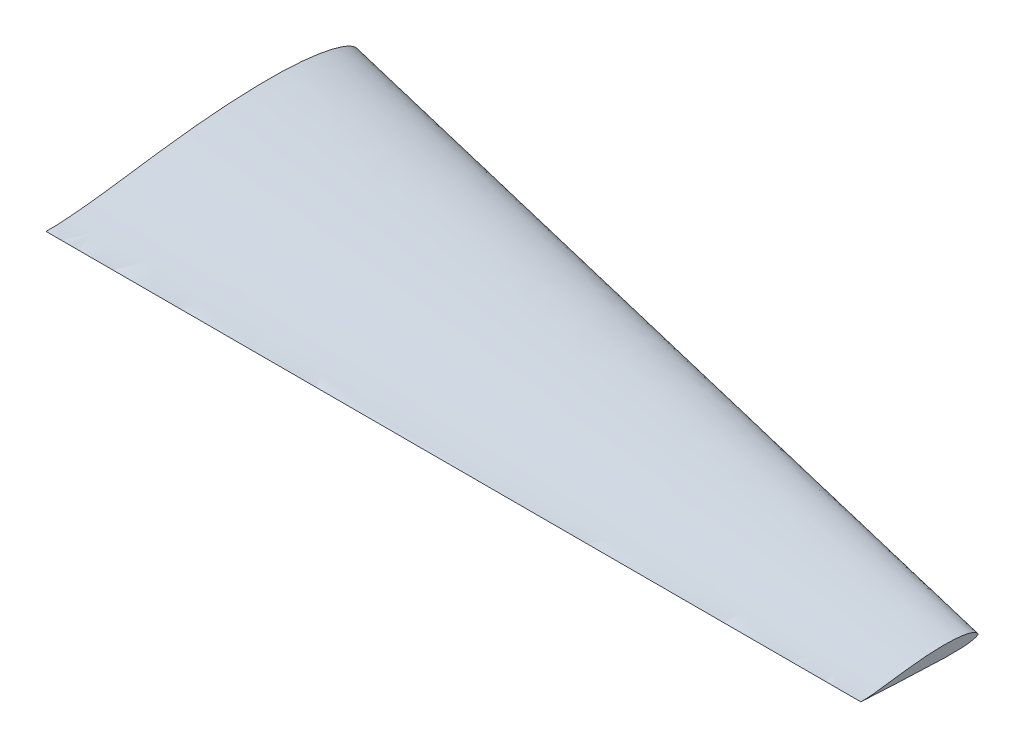
ISO-10303-21;
HEADER;
FILE_DESCRIPTION(('STEP AP214'),'2;1');
FILE_NAME('part.step','',(''),(''),'','','');
FILE_SCHEMA(('AUTOMOTIVE_DESIGN { 1 0 10303 214 1 1 1 1 }'));
ENDSEC;
DATA;
#1=APPLICATION_CONTEXT('core data for automotive mechanical design processes');
#2=APPLICATION_PROTOCOL_DEFINITION('international standard','automotive_design',2000,#1);
#3=PRODUCT_CONTEXT('',#1,'mechanical');
#4=PRODUCT('Part','Part','',(#3));
#5=PRODUCT_RELATED_PRODUCT_CATEGORY('part','',(#4));
#6=PRODUCT_DEFINITION_FORMATION('','',#4);
#7=PRODUCT_DEFINITION_CONTEXT('part definition',#1,'design');
#8=PRODUCT_DEFINITION('design','',#6,#7);
#9=PRODUCT_DEFINITION_SHAPE('','',#8);
#10=(LENGTH_UNIT() NAMED_UNIT(*) SI_UNIT(.MILLI.,.METRE.));
#11=(NAMED_UNIT(*) PLANE_ANGLE_UNIT() SI_UNIT($,.RADIAN.));
#12=(NAMED_UNIT(*) SI_UNIT($,.STERADIAN.) SOLID_ANGLE_UNIT());
#13=UNCERTAINTY_MEASURE_WITH_UNIT(LENGTH_MEASURE(1.E-05),#10,'distance_accuracy_value','');
#14=(GEOMETRIC_REPRESENTATION_CONTEXT(3) GLOBAL_UNCERTAINTY_ASSIGNED_CONTEXT((#13)) GLOBAL_UNIT_ASSIGNED_CONTEXT((#10,
#11,#12)) REPRESENTATION_CONTEXT('',''));
#15=CARTESIAN_POINT('',(0.,0.,0.));
#16=DIRECTION('',(0.,0.,1.));
#17=DIRECTION('',(1.,0.,0.));
#18=AXIS2_PLACEMENT_3D('',#15,#16,#17);
#19=CARTESIAN_POINT('',(0.,0.,230.));
#20=CARTESIAN_POINT('',(600.,0.,230.));
#21=CARTESIAN_POINT('',(0.,-0.0082062475415843,229.99550633643));
#22=CARTESIAN_POINT('',(600.,-0.00307734282809414,229.998314876161));
#23=CARTESIAN_POINT('',(0.,-0.135267469170388,228.485092216875));
#24=CARTESIAN_POINT('',(600.,-0.0507253009388954,229.431909581328));
#25=CARTESIAN_POINT('',(0.,-0.291564782272178,226.940926623229));
#26=CARTESIAN_POINT('',(600.,-0.109336793352067,228.852847483711));
#27=CARTESIAN_POINT('',(0.,-0.541099501440094,223.255068917962));
#28=CARTESIAN_POINT('',(600.,-0.202912313040035,227.470650844236));
#29=CARTESIAN_POINT('',(0.,-0.782106591361825,218.714630229672));
#30=CARTESIAN_POINT('',(600.,-0.293289971760684,225.767986336127));
#31=CARTESIAN_POINT('',(0.,-1.07679461546236,212.772829197252));
#32=CARTESIAN_POINT('',(600.,-0.403797980798386,223.539810948969));
#33=CARTESIAN_POINT('',(0.,-1.40679705402564,205.737405581358));
#34=CARTESIAN_POINT('',(600.,-0.527548895259613,220.901527093009));
#35=CARTESIAN_POINT('',(0.,-1.7856410252002,197.610287535246));
#36=CARTESIAN_POINT('',(600.,-0.669615384450076,217.853857825717));
#37=CARTESIAN_POINT('',(0.,-2.20799710953163,188.523480785416));
#38=CARTESIAN_POINT('',(600.,-0.827998916074361,214.446305294531));
#39=CARTESIAN_POINT('',(0.,-2.67732914495955,178.581313705506));
#40=CARTESIAN_POINT('',(600.,-1.00399842935983,210.717992639565));
#41=CARTESIAN_POINT('',(0.,-3.36369250042785,163.979362083074));
#42=CARTESIAN_POINT('',(600.,-1.26138468766044,205.242260781153));
#43=CARTESIAN_POINT('',(0.,-4.08954016879334,148.66934255325));
#44=CARTESIAN_POINT('',(600.,-1.5335775632975,199.501003457469));
#45=CARTESIAN_POINT('',(0.,-4.84576621202072,132.83969823276));
#46=CARTESIAN_POINT('',(600.,-1.81716232950777,193.564886837285));
#47=CARTESIAN_POINT('',(0.,-5.61058071445715,116.560889670257));
#48=CARTESIAN_POINT('',(600.,-2.10396776792143,187.460333626346));
#49=CARTESIAN_POINT('',(0.,-6.51074319109675,96.5283468950798));
#50=CARTESIAN_POINT('',(600.,-2.44152869666128,179.948130085655));
#51=CARTESIAN_POINT('',(0.,-7.21277834795782,76.9316001284855));
#52=CARTESIAN_POINT('',(600.,-2.70479188048418,172.599350048182));
#53=CARTESIAN_POINT('',(0.,-7.52384641081948,62.0490116038673));
#54=CARTESIAN_POINT('',(600.,-2.8214424040573,167.01837935145));
#55=CARTESIAN_POINT('',(0.,-7.60678653783824,51.7726733764599));
#56=CARTESIAN_POINT('',(600.,-2.85254495168934,163.164752516172));
#57=CARTESIAN_POINT('',(0.,-7.52543085127622,42.2403552850101));
#58=CARTESIAN_POINT('',(600.,-2.82203656922858,159.590133231879));
#59=CARTESIAN_POINT('',(0.,-7.24939752451994,33.5398710758184));
#60=CARTESIAN_POINT('',(600.,-2.71852407169498,156.327451653432));
#61=CARTESIAN_POINT('',(0.,-6.7672589537355,25.7392505660312));
#62=CARTESIAN_POINT('',(600.,-2.53772210765081,153.402218962262));
#63=CARTESIAN_POINT('',(0.,-6.06112864788893,18.8846437188858));
#64=CARTESIAN_POINT('',(600.,-2.27292324295835,150.831741394582));
#65=CARTESIAN_POINT('',(0.,-5.15001586044126,13.0174845020671));
#66=CARTESIAN_POINT('',(600.,-1.93125594766547,148.631556688275));
#67=CARTESIAN_POINT('',(0.,-4.11053118689255,8.16666460749667));
#68=CARTESIAN_POINT('',(600.,-1.54144919508471,146.812499227811));
#69=CARTESIAN_POINT('',(0.,-2.96592610699822,4.33664048894501));
#70=CARTESIAN_POINT('',(600.,-1.11222229012433,145.376240183354));
#71=CARTESIAN_POINT('',(0.,-1.96986103899488,1.95921081820761));
#72=CARTESIAN_POINT('',(600.,-0.738697889623081,144.484704056828));
#73=CARTESIAN_POINT('',(0.,-1.17044084643154,0.788083649793881));
#74=CARTESIAN_POINT('',(600.,-0.438915317411827,144.045531368673));
#75=CARTESIAN_POINT('',(0.,-0.852010733508358,0.414846845216228));
#76=CARTESIAN_POINT('',(600.,-0.319504025065634,143.905567566956));
#77=CARTESIAN_POINT('',(0.,-0.578498991776007,0.173751749342912));
#78=CARTESIAN_POINT('',(600.,-0.216937121916003,143.815156906004));
#79=CARTESIAN_POINT('',(0.,-0.342510513044142,0.0366604841952527));
#80=CARTESIAN_POINT('',(600.,-0.128441442391553,143.763747681573));
#81=CARTESIAN_POINT('',(0.,-0.0817480130318126,-0.00679230322978494));
#82=CARTESIAN_POINT('',(600.,-0.0306555048869298,143.747452886289));
#83=CARTESIAN_POINT('',(0.,0.247786011825164,0.00936454005397637));
#84=CARTESIAN_POINT('',(600.,0.0929197544344363,143.75351170252));
#85=CARTESIAN_POINT('',(0.,0.660814805834424,0.0992538734112158));
#86=CARTESIAN_POINT('',(600.,0.247805552187909,143.787220202529));
#87=CARTESIAN_POINT('',(0.,1.57918857500347,0.448411437218929));
#88=CARTESIAN_POINT('',(600.,0.592195715626303,143.918154288957));
#89=CARTESIAN_POINT('',(0.,3.02339320872855,1.53811426339969));
#90=CARTESIAN_POINT('',(600.,1.13377245327321,144.326792848775));
#91=CARTESIAN_POINT('',(0.,4.83829467215368,3.69513411963516));
#92=CARTESIAN_POINT('',(600.,1.81436050205763,145.135675294863));
#93=CARTESIAN_POINT('',(0.,6.68643100238334,6.84506594978927));
#94=CARTESIAN_POINT('',(600.,2.50741162589375,146.316899731171));
#95=CARTESIAN_POINT('',(0.,8.44249806733999,10.9369043678375));
#96=CARTESIAN_POINT('',(600.,3.16593677525249,147.851339137939));
#97=CARTESIAN_POINT('',(0.,10.0631711567476,15.9659890629664));
#98=CARTESIAN_POINT('',(600.,3.77368918378035,149.737245898612));
#99=CARTESIAN_POINT('',(0.,11.5039286209944,21.9098390057512));
#100=CARTESIAN_POINT('',(600.,4.3139732328729,151.966189627157));
#101=CARTESIAN_POINT('',(0.,12.746934286349,28.7284697098079));
#102=CARTESIAN_POINT('',(600.,4.78010035738088,154.523176141178));
#103=CARTESIAN_POINT('',(0.,13.7621974296975,36.370966642078));
#104=CARTESIAN_POINT('',(600.,5.16082403613657,157.389112490779));
#105=CARTESIAN_POINT('',(0.,14.5251177207044,44.7765973723467));
#106=CARTESIAN_POINT('',(600.,5.44691914526414,160.54122401463));
#107=CARTESIAN_POINT('',(0.,15.2000354732484,57.3100648528985));
#108=CARTESIAN_POINT('',(600.,5.70001330246816,165.241274319837));
#109=CARTESIAN_POINT('',(0.,15.2458212360791,70.6382851821577));
#110=CARTESIAN_POINT('',(600.,5.71718296352967,170.239356943309));
#111=CARTESIAN_POINT('',(0.,14.8038780329214,84.6261293171371));
#112=CARTESIAN_POINT('',(600.,5.55145426234554,175.484798493926));
#113=CARTESIAN_POINT('',(0.,14.0095894524362,99.5804985233402));
#114=CARTESIAN_POINT('',(600.,5.25359604466356,181.092686946253));
#115=CARTESIAN_POINT('',(0.,12.7590942449516,114.797198459082));
#116=CARTESIAN_POINT('',(600.,4.78466034185686,186.798949422156));
#117=CARTESIAN_POINT('',(0.,11.0976540076416,130.132894047301));
#118=CARTESIAN_POINT('',(600.,4.1616202528656,192.549835267738));
#119=CARTESIAN_POINT('',(0.,9.67135166711376,141.639348147375));
#120=CARTESIAN_POINT('',(600.,3.62675687516766,196.864755555266));
#121=CARTESIAN_POINT('',(0.,8.12586023369963,153.007094815131));
#122=CARTESIAN_POINT('',(600.,3.04719758763736,201.127660555674));
#123=CARTESIAN_POINT('',(0.,6.53212419996719,164.130644257177));
#124=CARTESIAN_POINT('',(600.,2.4495465749877,205.298991596441));
#125=CARTESIAN_POINT('',(0.,4.99146579780588,174.889266379888));
#126=CARTESIAN_POINT('',(600.,1.87179967417721,209.333474892458));
#127=CARTESIAN_POINT('',(0.,3.58544950227951,185.133275473252));
#128=CARTESIAN_POINT('',(600.,1.34454356335481,213.174978302469));
#129=CARTESIAN_POINT('',(0.,2.40886455966791,194.686839482205));
#130=CARTESIAN_POINT('',(600.,0.903324209875467,216.757564805827));
#131=CARTESIAN_POINT('',(0.,1.48706278250121,203.376836631186));
#132=CARTESIAN_POINT('',(600.,0.557648543437952,220.016313736695));
#133=CARTESIAN_POINT('',(0.,0.794625388098197,211.001807941287));
#134=CARTESIAN_POINT('',(600.,0.297984520536824,222.875677977983));
#135=CARTESIAN_POINT('',(0.,0.323036393813824,217.526736968913));
#136=CARTESIAN_POINT('',(600.,0.121138647680184,225.322526363343));
#137=CARTESIAN_POINT('',(0.,0.0358828056563927,222.555024858288));
#138=CARTESIAN_POINT('',(600.,0.0134560521211472,227.208134321858));
#139=CARTESIAN_POINT('',(0.,-0.0427008819124463,226.674777856557));
#140=CARTESIAN_POINT('',(600.,-0.0160128307171674,228.753041696209));
#141=CARTESIAN_POINT('',(0.,-0.0636208369007356,228.353751955085));
#142=CARTESIAN_POINT('',(600.,-0.0238578138377759,229.382656983156));
#143=CARTESIAN_POINT('',(0.,0.00852822696902911,230.00466997646));
#144=CARTESIAN_POINT('',(600.,0.00319808511338589,230.001751241173));
#145=CARTESIAN_POINT('',(0.,0.,230.));
#146=CARTESIAN_POINT('',(600.,0.,230.));
#147=B_SPLINE_SURFACE_WITH_KNOTS('',3,1,((#19,#20),(#21,#22),(#23,#24),(#25,#26),(#27,#28),(#29,
#30),(#31,#32),(#33,#34),(#35,#36),(#37,#38),(#39,#40),(#41,#42),(#43,#44),(#45,#46),(#47,#48),
(#49,#50),(#51,#52),(#53,#54),(#55,#56),(#57,#58),(#59,#60),(#61,#62),(#63,#64),(#65,#66),(#67,
#68),(#69,#70),(#71,#72),(#73,#74),(#75,#76),(#77,#78),(#79,#80),(#81,#82),(#83,#84),(#85,#86),
(#87,#88),(#89,#90),(#91,#92),(#93,#94),(#95,#96),(#97,#98),(#99,#100),(#101,#102),(#103,#104),
(#105,#106),(#107,#108),(#109,#110),(#111,#112),(#113,#114),(#115,#116),(#117,#118),(#119,#120),
(#121,#122),(#123,#124),(#125,#126),(#127,#128),(#129,#130),(#131,#132),(#133,#134),(#135,#136),
(#137,#138),(#139,#140),(#141,#142),(#143,#144),(#145,#146)),.UNSPECIFIED.,.T.,.F.,.F.,(4,1,1,1,
1,1,1,1,1,1,1,1,1,1,1,1,1,1,1,1,1,1,1,1,1,1,1,1,1,1,1,1,1,1,1,1,1,1,1,1,1,1,1,1,1,1,1,1,1,1,1,1,
1,1,1,1,1,1,1,1,1,4),(2,2),(0.,0.00156902242470858,0.00609472687311585,0.0133937024500703,
0.023441916553709,0.0361442142412866,0.0513409264225788,0.0688414894612517,0.088426757068893,
0.109848433133019,0.132842617540644,0.182430201403837,0.208410010459426,0.234751729853241,
0.287227095604107,0.337359598566606,0.360846377811904,0.382948984287468,0.403441850357787,
0.422142629319319,0.438919292860685,0.453690524678135,0.466435701245643,0.47708985530233,
0.48554887823177,0.49215879950553,0.49351163067827,0.494655412052928,0.495302135948485,
0.495851847341695,0.496383541086134,0.496974953955053,0.497967072975259,0.49908730474204,
0.503272026510726,0.509381342850784,0.517144596981113,0.526658923170185,0.537966500830243,
0.551081799907151,0.565960940134225,0.582516488383098,0.600642429265994,0.620222136807,
0.663214047191939,0.686312208976295,0.710208787173181,0.759507526864647,0.78447574334181,
0.809397911907876,0.834064089757377,0.858247869964319,0.881658293381867,0.903954676016528,
0.924735123979053,0.943566574499178,0.960107217493794,0.974089881602399,0.985277147075571,
0.993441094076043,0.998369415583724,1.),(0.,1.),.UNSPECIFIED.);
#148=CARTESIAN_POINT('',(0.,0.,230.));
#149=CARTESIAN_POINT('',(0.,-0.0082062475415843,229.99550633643));
#150=CARTESIAN_POINT('',(0.,-0.135267469170388,228.485092216875));
#151=CARTESIAN_POINT('',(0.,-0.291564782272178,226.940926623229));
#152=CARTESIAN_POINT('',(0.,-0.541099501440094,223.255068917962));
#153=CARTESIAN_POINT('',(0.,-0.782106591361825,218.714630229672));
#154=CARTESIAN_POINT('',(0.,-1.07679461546236,212.772829197252));
#155=CARTESIAN_POINT('',(0.,-1.40679705402564,205.737405581358));
#156=CARTESIAN_POINT('',(0.,-1.7856410252002,197.610287535246));
#157=CARTESIAN_POINT('',(0.,-2.20799710953163,188.523480785416));
#158=CARTESIAN_POINT('',(0.,-2.67732914495955,178.581313705506));
#159=CARTESIAN_POINT('',(0.,-3.36369250042785,163.979362083074));
#160=CARTESIAN_POINT('',(0.,-4.08954016879334,148.66934255325));
#161=CARTESIAN_POINT('',(0.,-4.84576621202072,132.83969823276));
#162=CARTESIAN_POINT('',(0.,-5.61058071445715,116.560889670257));
#163=CARTESIAN_POINT('',(0.,-6.51074319109675,96.5283468950798));
#164=CARTESIAN_POINT('',(0.,-7.21277834795782,76.9316001284855));
#165=CARTESIAN_POINT('',(0.,-7.52384641081948,62.0490116038673));
#166=CARTESIAN_POINT('',(0.,-7.60678653783824,51.7726733764599));
#167=CARTESIAN_POINT('',(0.,-7.52543085127622,42.2403552850101));
#168=CARTESIAN_POINT('',(0.,-7.24939752451994,33.5398710758184));
#169=CARTESIAN_POINT('',(0.,-6.7672589537355,25.7392505660312));
#170=CARTESIAN_POINT('',(0.,-6.06112864788893,18.8846437188858));
#171=CARTESIAN_POINT('',(0.,-5.15001586044126,13.0174845020671));
#172=CARTESIAN_POINT('',(0.,-4.11053118689255,8.16666460749667));
#173=CARTESIAN_POINT('',(0.,-2.96592610699822,4.33664048894501));
#174=CARTESIAN_POINT('',(0.,-1.96986103899488,1.95921081820761));
#175=CARTESIAN_POINT('',(0.,-1.17044084643154,0.788083649793881));
#176=CARTESIAN_POINT('',(0.,-0.852010733508358,0.414846845216228));
#177=CARTESIAN_POINT('',(0.,-0.578498991776007,0.173751749342912));
#178=CARTESIAN_POINT('',(0.,-0.342510513044142,0.0366604841952527));
#179=CARTESIAN_POINT('',(0.,-0.0817480130318126,-0.00679230322978494));
#180=CARTESIAN_POINT('',(0.,0.247786011825164,0.00936454005397637));
#181=CARTESIAN_POINT('',(0.,0.660814805834424,0.0992538734112158));
#182=CARTESIAN_POINT('',(0.,1.57918857500347,0.448411437218929));
#183=CARTESIAN_POINT('',(0.,3.02339320872855,1.53811426339969));
#184=CARTESIAN_POINT('',(0.,4.83829467215368,3.69513411963516));
#185=CARTESIAN_POINT('',(0.,6.68643100238334,6.84506594978927));
#186=CARTESIAN_POINT('',(0.,8.44249806733999,10.9369043678375));
#187=CARTESIAN_POINT('',(0.,10.0631711567476,15.9659890629664));
#188=CARTESIAN_POINT('',(0.,11.5039286209944,21.9098390057512));
#189=CARTESIAN_POINT('',(0.,12.746934286349,28.7284697098079));
#190=CARTESIAN_POINT('',(0.,13.7621974296975,36.370966642078));
#191=CARTESIAN_POINT('',(0.,14.5251177207044,44.7765973723467));
#192=CARTESIAN_POINT('',(0.,15.2000354732484,57.3100648528985));
#193=CARTESIAN_POINT('',(0.,15.2458212360791,70.6382851821577));
#194=CARTESIAN_POINT('',(0.,14.8038780329214,84.6261293171371));
#195=CARTESIAN_POINT('',(0.,14.0095894524362,99.5804985233402));
#196=CARTESIAN_POINT('',(0.,12.7590942449516,114.797198459082));
#197=CARTESIAN_POINT('',(0.,11.0976540076416,130.132894047301));
#198=CARTESIAN_POINT('',(0.,9.67135166711376,141.639348147375));
#199=CARTESIAN_POINT('',(0.,8.12586023369963,153.007094815131));
#200=CARTESIAN_POINT('',(0.,6.53212419996719,164.130644257177));
#201=CARTESIAN_POINT('',(0.,4.99146579780588,174.889266379888));
#202=CARTESIAN_POINT('',(0.,3.58544950227951,185.133275473252));
#203=CARTESIAN_POINT('',(0.,2.40886455966791,194.686839482205));
#204=CARTESIAN_POINT('',(0.,1.48706278250121,203.376836631186));
#205=CARTESIAN_POINT('',(0.,0.794625388098197,211.001807941287));
#206=CARTESIAN_POINT('',(0.,0.323036393813824,217.526736968913));
#207=CARTESIAN_POINT('',(0.,0.0358828056563927,222.555024858288));
#208=CARTESIAN_POINT('',(0.,-0.0427008819124463,226.674777856557));
#209=CARTESIAN_POINT('',(0.,-0.0636208369007356,228.353751955085));
#210=CARTESIAN_POINT('',(0.,0.00852822696902911,230.00466997646));
#211=CARTESIAN_POINT('',(0.,0.,230.));
#212=B_SPLINE_CURVE_WITH_KNOTS('',3,(#148,#149,#150,#151,#152,#153,#154,#155,#156,#157,#158,
#159,#160,#161,#162,#163,#164,#165,#166,#167,#168,#169,#170,#171,#172,#173,#174,#175,#176,#177,
#178,#179,#180,#181,#182,#183,#184,#185,#186,#187,#188,#189,#190,#191,#192,#193,#194,#195,#196,
#197,#198,#199,#200,#201,#202,#203,#204,#205,#206,#207,#208,#209,#210,#211),.UNSPECIFIED.,.T.,
.F.,(4,1,1,1,1,1,1,1,1,1,1,1,1,1,1,1,1,1,1,1,1,1,1,1,1,1,1,1,1,1,1,1,1,1,1,1,1,1,1,1,1,1,1,1,1,
1,1,1,1,1,1,1,1,1,1,1,1,1,1,1,1,4),(0.,0.00156902242470858,0.00609472687311585,
0.0133937024500703,0.023441916553709,0.0361442142412866,0.0513409264225788,0.0688414894612517,
0.088426757068893,0.109848433133019,0.132842617540644,0.182430201403837,0.208410010459426,
0.234751729853241,0.287227095604107,0.337359598566606,0.360846377811904,0.382948984287468,
0.403441850357787,0.422142629319319,0.438919292860685,0.453690524678135,0.466435701245643,
0.47708985530233,0.48554887823177,0.49215879950553,0.49351163067827,0.494655412052928,
0.495302135948485,0.495851847341695,0.496383541086134,0.496974953955053,0.497967072975259,
0.49908730474204,0.503272026510726,0.509381342850784,0.517144596981113,0.526658923170185,
0.537966500830243,0.551081799907151,0.565960940134225,0.582516488383098,0.600642429265994,
0.620222136807,0.663214047191939,0.686312208976295,0.710208787173181,0.759507526864647,
0.78447574334181,0.809397911907876,0.834064089757377,0.858247869964319,0.881658293381867,
0.903954676016528,0.924735123979053,0.943566574499178,0.960107217493794,0.974089881602399,
0.985277147075571,0.993441094076043,0.998369415583724,1.),.UNSPECIFIED.);
#213=CARTESIAN_POINT('',(0.,0.,230.));
#214=VERTEX_POINT('',#213);
#215=EDGE_CURVE('E11',#214,#214,#212,.T.);
#216=CARTESIAN_POINT('',(600.,0.,230.));
#217=CARTESIAN_POINT('',(600.,-0.00307734282809414,229.998314876161));
#218=CARTESIAN_POINT('',(600.,-0.0507253009388954,229.431909581328));
#219=CARTESIAN_POINT('',(600.,-0.109336793352067,228.852847483711));
#220=CARTESIAN_POINT('',(600.,-0.202912313040035,227.470650844236));
#221=CARTESIAN_POINT('',(600.,-0.293289971760684,225.767986336127));
#222=CARTESIAN_POINT('',(600.,-0.403797980798386,223.539810948969));
#223=CARTESIAN_POINT('',(600.,-0.527548895259613,220.901527093009));
#224=CARTESIAN_POINT('',(600.,-0.669615384450076,217.853857825717));
#225=CARTESIAN_POINT('',(600.,-0.827998916074361,214.446305294531));
#226=CARTESIAN_POINT('',(600.,-1.00399842935983,210.717992639565));
#227=CARTESIAN_POINT('',(600.,-1.26138468766044,205.242260781153));
#228=CARTESIAN_POINT('',(600.,-1.5335775632975,199.501003457469));
#229=CARTESIAN_POINT('',(600.,-1.81716232950777,193.564886837285));
#230=CARTESIAN_POINT('',(600.,-2.10396776792143,187.460333626346));
#231=CARTESIAN_POINT('',(600.,-2.44152869666128,179.948130085655));
#232=CARTESIAN_POINT('',(600.,-2.70479188048418,172.599350048182));
#233=CARTESIAN_POINT('',(600.,-2.8214424040573,167.01837935145));
#234=CARTESIAN_POINT('',(600.,-2.85254495168934,163.164752516172));
#235=CARTESIAN_POINT('',(600.,-2.82203656922858,159.590133231879));
#236=CARTESIAN_POINT('',(600.,-2.71852407169498,156.327451653432));
#237=CARTESIAN_POINT('',(600.,-2.53772210765081,153.402218962262));
#238=CARTESIAN_POINT('',(600.,-2.27292324295835,150.831741394582));
#239=CARTESIAN_POINT('',(600.,-1.93125594766547,148.631556688275));
#240=CARTESIAN_POINT('',(600.,-1.54144919508471,146.812499227811));
#241=CARTESIAN_POINT('',(600.,-1.11222229012433,145.376240183354));
#242=CARTESIAN_POINT('',(600.,-0.738697889623081,144.484704056828));
#243=CARTESIAN_POINT('',(600.,-0.438915317411827,144.045531368673));
#244=CARTESIAN_POINT('',(600.,-0.319504025065634,143.905567566956));
#245=CARTESIAN_POINT('',(600.,-0.216937121916003,143.815156906004));
#246=CARTESIAN_POINT('',(600.,-0.128441442391553,143.763747681573));
#247=CARTESIAN_POINT('',(600.,-0.0306555048869298,143.747452886289));
#248=CARTESIAN_POINT('',(600.,0.0929197544344363,143.75351170252));
#249=CARTESIAN_POINT('',(600.,0.247805552187909,143.787220202529));
#250=CARTESIAN_POINT('',(600.,0.592195715626303,143.918154288957));
#251=CARTESIAN_POINT('',(600.,1.13377245327321,144.326792848775));
#252=CARTESIAN_POINT('',(600.,1.81436050205763,145.135675294863));
#253=CARTESIAN_POINT('',(600.,2.50741162589375,146.316899731171));
#254=CARTESIAN_POINT('',(600.,3.16593677525249,147.851339137939));
#255=CARTESIAN_POINT('',(600.,3.77368918378035,149.737245898612));
#256=CARTESIAN_POINT('',(600.,4.3139732328729,151.966189627157));
#257=CARTESIAN_POINT('',(600.,4.78010035738088,154.523176141178));
#258=CARTESIAN_POINT('',(600.,5.16082403613657,157.389112490779));
#259=CARTESIAN_POINT('',(600.,5.44691914526414,160.54122401463));
#260=CARTESIAN_POINT('',(600.,5.70001330246816,165.241274319837));
#261=CARTESIAN_POINT('',(600.,5.71718296352967,170.239356943309));
#262=CARTESIAN_POINT('',(600.,5.55145426234554,175.484798493926));
#263=CARTESIAN_POINT('',(600.,5.25359604466356,181.092686946253));
#264=CARTESIAN_POINT('',(600.,4.78466034185686,186.798949422156));
#265=CARTESIAN_POINT('',(600.,4.1616202528656,192.549835267738));
#266=CARTESIAN_POINT('',(600.,3.62675687516766,196.864755555266));
#267=CARTESIAN_POINT('',(600.,3.04719758763736,201.127660555674));
#268=CARTESIAN_POINT('',(600.,2.4495465749877,205.298991596441));
#269=CARTESIAN_POINT('',(600.,1.87179967417721,209.333474892458));
#270=CARTESIAN_POINT('',(600.,1.34454356335481,213.174978302469));
#271=CARTESIAN_POINT('',(600.,0.903324209875467,216.757564805827));
#272=CARTESIAN_POINT('',(600.,0.557648543437952,220.016313736695));
#273=CARTESIAN_POINT('',(600.,0.297984520536824,222.875677977983));
#274=CARTESIAN_POINT('',(600.,0.121138647680184,225.322526363343));
#275=CARTESIAN_POINT('',(600.,0.0134560521211472,227.208134321858));
#276=CARTESIAN_POINT('',(600.,-0.0160128307171674,228.753041696209));
#277=CARTESIAN_POINT('',(600.,-0.0238578138377759,229.382656983156));
#278=CARTESIAN_POINT('',(600.,0.00319808511338589,230.001751241173));
#279=CARTESIAN_POINT('',(600.,0.,230.));
#280=B_SPLINE_CURVE_WITH_KNOTS('',3,(#216,#217,#218,#219,#220,#221,#222,#223,#224,#225,#226,
#227,#228,#229,#230,#231,#232,#233,#234,#235,#236,#237,#238,#239,#240,#241,#242,#243,#244,#245,
#246,#247,#248,#249,#250,#251,#252,#253,#254,#255,#256,#257,#258,#259,#260,#261,#262,#263,#264,
#265,#266,#267,#268,#269,#270,#271,#272,#273,#274,#275,#276,#277,#278,#279),.UNSPECIFIED.,.T.,
.F.,(4,1,1,1,1,1,1,1,1,1,1,1,1,1,1,1,1,1,1,1,1,1,1,1,1,1,1,1,1,1,1,1,1,1,1,1,1,1,1,1,1,1,1,1,1,
1,1,1,1,1,1,1,1,1,1,1,1,1,1,1,1,4),(0.,0.00156902242470858,0.00609472687311585,
0.0133937024500703,0.023441916553709,0.0361442142412866,0.0513409264225788,0.0688414894612517,
0.088426757068893,0.109848433133019,0.132842617540644,0.182430201403837,0.208410010459426,
0.234751729853241,0.287227095604107,0.337359598566606,0.360846377811904,0.382948984287468,
0.403441850357787,0.422142629319319,0.438919292860685,0.453690524678135,0.466435701245643,
0.47708985530233,0.48554887823177,0.49215879950553,0.49351163067827,0.494655412052928,
0.495302135948485,0.495851847341695,0.496383541086134,0.496974953955053,0.497967072975259,
0.49908730474204,0.503272026510726,0.509381342850784,0.517144596981113,0.526658923170185,
0.537966500830243,0.551081799907151,0.565960940134225,0.582516488383098,0.600642429265994,
0.620222136807,0.663214047191939,0.686312208976295,0.710208787173181,0.759507526864647,
0.78447574334181,0.809397911907876,0.834064089757377,0.858247869964319,0.881658293381867,
0.903954676016528,0.924735123979053,0.943566574499178,0.960107217493794,0.974089881602399,
0.985277147075571,0.993441094076043,0.998369415583724,1.),.UNSPECIFIED.);
#281=CARTESIAN_POINT('',(600.,0.,230.));
#282=VERTEX_POINT('',#281);
#283=EDGE_CURVE('E52',#282,#282,#280,.T.);
#284=ORIENTED_EDGE('',*,*,#215,.T.);
#285=EDGE_LOOP('',(#284));
#286=FACE_BOUND('',#285,.T.);
#287=ORIENTED_EDGE('',*,*,#283,.F.);
#288=EDGE_LOOP('',(#287));
#289=FACE_BOUND('',#288,.T.);
#290=ADVANCED_FACE('F48',(#286,#289),#147,.T.);
#291=CARTESIAN_POINT('',(0.,1.50695170823198,0.480825692549506));
#292=DIRECTION('',(-1.,0.,0.));
#293=DIRECTION('',(0.,0.,1.));
#294=AXIS2_PLACEMENT_3D('',#291,#292,#293);
#295=PLANE('',#294);
#296=ORIENTED_EDGE('',*,*,#215,.F.);
#297=EDGE_LOOP('',(#296));
#298=FACE_BOUND('',#297,.T.);
#299=ADVANCED_FACE('F70',(#298),#295,.T.);
#300=CARTESIAN_POINT('',(600.,0.565106890586991,143.930309634706));
#301=DIRECTION('',(-1.,0.,0.));
#302=DIRECTION('',(0.,0.,1.));
#303=AXIS2_PLACEMENT_3D('',#300,#301,#302);
#304=PLANE('',#303);
#305=ORIENTED_EDGE('',*,*,#283,.T.);
#306=EDGE_LOOP('',(#305));
#307=FACE_BOUND('',#306,.T.);
#308=ADVANCED_FACE('F50',(#307),#304,.F.);
#309=CLOSED_SHELL('',(#290,#299,#308));
#310=MANIFOLD_SOLID_BREP('B2',#309);
#311=ADVANCED_BREP_SHAPE_REPRESENTATION('',(#18,#310),#14);
#312=SHAPE_DEFINITION_REPRESENTATION(#9,#311);
ENDSEC;
END-ISO-10303-21;
